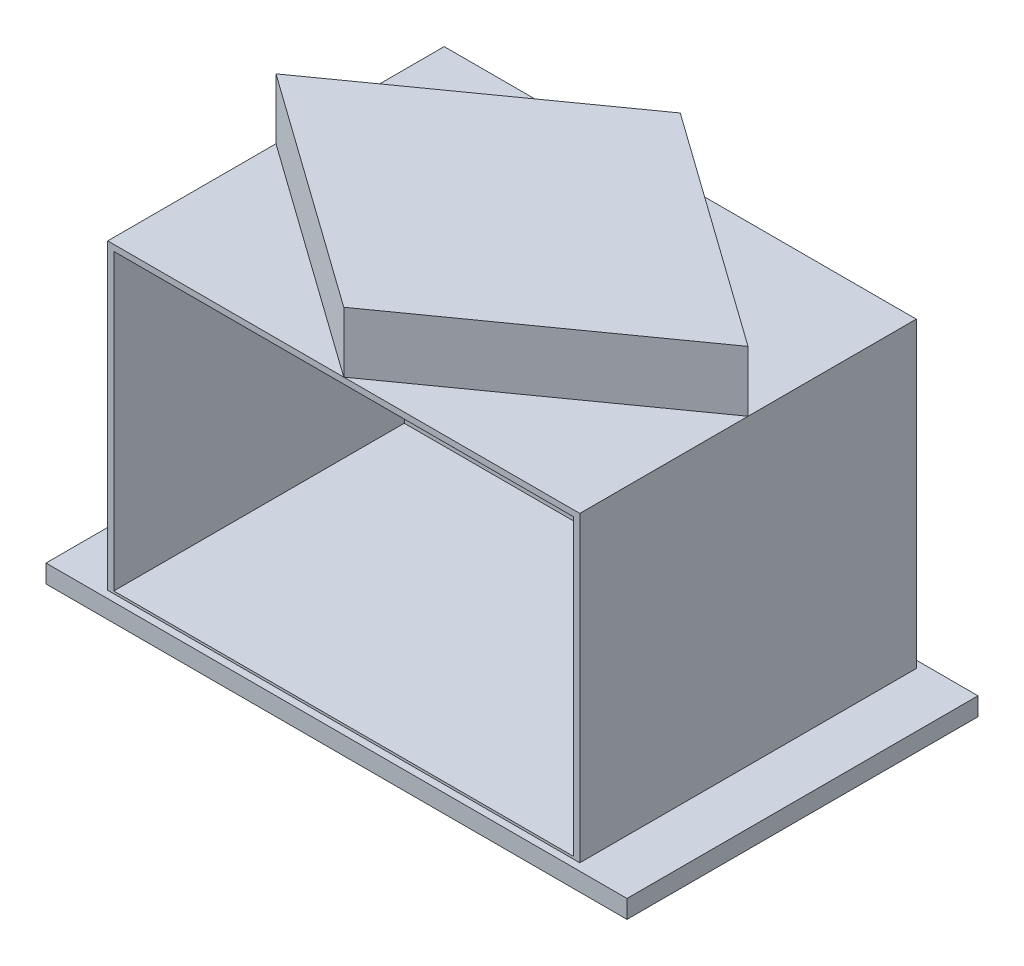
ISO-10303-21;
HEADER;
FILE_DESCRIPTION(('STEP AP214'),'2;1');
FILE_NAME('part.step','',(''),(''),'','','');
FILE_SCHEMA(('AUTOMOTIVE_DESIGN { 1 0 10303 214 1 1 1 1 }'));
ENDSEC;
DATA;
#1=APPLICATION_CONTEXT('core data for automotive mechanical design processes');
#2=APPLICATION_PROTOCOL_DEFINITION('international standard','automotive_design',2000,#1);
#3=PRODUCT_CONTEXT('',#1,'mechanical');
#4=PRODUCT('Part','Part','',(#3));
#5=PRODUCT_RELATED_PRODUCT_CATEGORY('part','',(#4));
#6=PRODUCT_DEFINITION_FORMATION('','',#4);
#7=PRODUCT_DEFINITION_CONTEXT('part definition',#1,'design');
#8=PRODUCT_DEFINITION('design','',#6,#7);
#9=PRODUCT_DEFINITION_SHAPE('','',#8);
#10=(LENGTH_UNIT() NAMED_UNIT(*) SI_UNIT(.MILLI.,.METRE.));
#11=(NAMED_UNIT(*) PLANE_ANGLE_UNIT() SI_UNIT($,.RADIAN.));
#12=(NAMED_UNIT(*) SI_UNIT($,.STERADIAN.) SOLID_ANGLE_UNIT());
#13=UNCERTAINTY_MEASURE_WITH_UNIT(LENGTH_MEASURE(1.E-05),#10,'distance_accuracy_value','');
#14=(GEOMETRIC_REPRESENTATION_CONTEXT(3) GLOBAL_UNCERTAINTY_ASSIGNED_CONTEXT((#13)) GLOBAL_UNIT_ASSIGNED_CONTEXT((#10,
#11,#12)) REPRESENTATION_CONTEXT('',''));
#15=CARTESIAN_POINT('',(0.,0.,0.));
#16=DIRECTION('',(0.,0.,1.));
#17=DIRECTION('',(1.,0.,0.));
#18=AXIS2_PLACEMENT_3D('',#15,#16,#17);
#19=CARTESIAN_POINT('',(0.,250.,0.));
#20=DIRECTION('',(0.,-1.,0.));
#21=DIRECTION('',(0.,0.,-1.));
#22=AXIS2_PLACEMENT_3D('',#19,#20,#21);
#23=PLANE('',#22);
#24=DIRECTION('',(-0.814297396356069,0.,-0.580447887658942));
#25=VECTOR('',#24,1.);
#26=CARTESIAN_POINT('',(195.,250.,0.));
#27=LINE('',#26,#25);
#28=CARTESIAN_POINT('',(195.,250.,0.));
#29=VERTEX_POINT('',#28);
#30=CARTESIAN_POINT('',(0.,250.,-139.));
#31=VERTEX_POINT('',#30);
#32=EDGE_CURVE('E177',#29,#31,#27,.T.);
#33=ORIENTED_EDGE('',*,*,#32,.F.);
#34=DIRECTION('',(0.,0.,-1.));
#35=VECTOR('',#34,1.);
#36=CARTESIAN_POINT('',(195.,250.,39.));
#37=LINE('',#36,#35);
#38=CARTESIAN_POINT('',(195.,250.,-139.));
#39=VERTEX_POINT('',#38);
#40=EDGE_CURVE('E232',#29,#39,#37,.T.);
#41=ORIENTED_EDGE('',*,*,#40,.T.);
#42=DIRECTION('',(-1.,0.,0.));
#43=VECTOR('',#42,1.);
#44=CARTESIAN_POINT('',(-195.,250.,-139.));
#45=LINE('',#44,#43);
#46=EDGE_CURVE('E233',#39,#31,#45,.T.);
#47=ORIENTED_EDGE('',*,*,#46,.T.);
#48=EDGE_LOOP('',(#33,#41,#47));
#49=FACE_BOUND('',#48,.T.);
#50=ADVANCED_FACE('F39',(#49),#23,.F.);
#51=DIRECTION('',(0.814297396356069,0.,-0.580447887658942));
#52=VECTOR('',#51,1.);
#53=CARTESIAN_POINT('',(0.,250.,139.));
#54=LINE('',#53,#52);
#55=CARTESIAN_POINT('',(1.11022302462516E-13,250.,139.));
#56=VERTEX_POINT('',#55);
#57=EDGE_CURVE('E56',#56,#29,#54,.T.);
#58=ORIENTED_EDGE('',*,*,#57,.F.);
#59=DIRECTION('',(-1.,0.,0.));
#60=VECTOR('',#59,1.);
#61=CARTESIAN_POINT('',(195.,250.,139.));
#62=LINE('',#61,#60);
#63=CARTESIAN_POINT('',(195.,250.,139.));
#64=VERTEX_POINT('',#63);
#65=EDGE_CURVE('E216',#64,#56,#62,.T.);
#66=ORIENTED_EDGE('',*,*,#65,.F.);
#67=EDGE_CURVE('E229',#64,#29,#37,.T.);
#68=ORIENTED_EDGE('',*,*,#67,.T.);
#69=EDGE_LOOP('',(#58,#66,#68));
#70=FACE_BOUND('',#69,.T.);
#71=ADVANCED_FACE('F305',(#70),#23,.F.);
#72=DIRECTION('',(0.814297396356069,0.,0.580447887658942));
#73=VECTOR('',#72,1.);
#74=CARTESIAN_POINT('',(-195.,250.,0.));
#75=LINE('',#74,#73);
#76=CARTESIAN_POINT('',(-195.,250.,0.));
#77=VERTEX_POINT('',#76);
#78=EDGE_CURVE('E329',#77,#56,#75,.T.);
#79=ORIENTED_EDGE('',*,*,#78,.F.);
#80=DIRECTION('',(0.,0.,1.));
#81=VECTOR('',#80,1.);
#82=CARTESIAN_POINT('',(-195.,250.,39.));
#83=LINE('',#82,#81);
#84=CARTESIAN_POINT('',(-195.,250.,139.));
#85=VERTEX_POINT('',#84);
#86=EDGE_CURVE('E236',#77,#85,#83,.T.);
#87=ORIENTED_EDGE('',*,*,#86,.T.);
#88=EDGE_CURVE('E209',#56,#85,#62,.T.);
#89=ORIENTED_EDGE('',*,*,#88,.F.);
#90=EDGE_LOOP('',(#79,#87,#89));
#91=FACE_BOUND('',#90,.T.);
#92=ADVANCED_FACE('F313',(#91),#23,.F.);
#93=DIRECTION('',(-0.814297396356069,0.,0.580447887658942));
#94=VECTOR('',#93,1.);
#95=CARTESIAN_POINT('',(0.,250.,-139.));
#96=LINE('',#95,#94);
#97=EDGE_CURVE('E64',#31,#77,#96,.T.);
#98=ORIENTED_EDGE('',*,*,#97,.F.);
#99=CARTESIAN_POINT('',(-195.,250.,-139.));
#100=VERTEX_POINT('',#99);
#101=EDGE_CURVE('E231',#31,#100,#45,.T.);
#102=ORIENTED_EDGE('',*,*,#101,.T.);
#103=EDGE_CURVE('E237',#100,#77,#83,.T.);
#104=ORIENTED_EDGE('',*,*,#103,.T.);
#105=EDGE_LOOP('',(#98,#102,#104));
#106=FACE_BOUND('',#105,.T.);
#107=ADVANCED_FACE('F308',(#106),#23,.F.);
#108=CARTESIAN_POINT('',(0.,0.,0.));
#109=DIRECTION('',(0.,-1.,0.));
#110=DIRECTION('',(0.,0.,-1.));
#111=AXIS2_PLACEMENT_3D('',#108,#109,#110);
#112=PLANE('',#111);
#113=DIRECTION('',(0.,0.,-1.));
#114=VECTOR('',#113,1.);
#115=CARTESIAN_POINT('',(240.,0.,145.));
#116=LINE('',#115,#114);
#117=CARTESIAN_POINT('',(240.,0.,145.));
#118=VERTEX_POINT('',#117);
#119=CARTESIAN_POINT('',(240.,0.,-145.));
#120=VERTEX_POINT('',#119);
#121=EDGE_CURVE('E252',#118,#120,#116,.T.);
#122=ORIENTED_EDGE('',*,*,#121,.T.);
#123=DIRECTION('',(-1.,0.,0.));
#124=VECTOR('',#123,1.);
#125=CARTESIAN_POINT('',(-240.,0.,-145.));
#126=LINE('',#125,#124);
#127=CARTESIAN_POINT('',(-240.,0.,-145.));
#128=VERTEX_POINT('',#127);
#129=EDGE_CURVE('E268',#120,#128,#126,.T.);
#130=ORIENTED_EDGE('',*,*,#129,.T.);
#131=DIRECTION('',(0.,0.,1.));
#132=VECTOR('',#131,1.);
#133=CARTESIAN_POINT('',(-240.,0.,145.));
#134=LINE('',#133,#132);
#135=CARTESIAN_POINT('',(-240.,0.,145.));
#136=VERTEX_POINT('',#135);
#137=EDGE_CURVE('E271',#128,#136,#134,.T.);
#138=ORIENTED_EDGE('',*,*,#137,.T.);
#139=DIRECTION('',(1.,0.,0.));
#140=VECTOR('',#139,1.);
#141=CARTESIAN_POINT('',(-240.,0.,145.));
#142=LINE('',#141,#140);
#143=EDGE_CURVE('E257',#136,#118,#142,.T.);
#144=ORIENTED_EDGE('',*,*,#143,.T.);
#145=EDGE_LOOP('',(#122,#130,#138,#144));
#146=FACE_BOUND('',#145,.T.);
#147=DIRECTION('',(1.,0.,0.));
#148=VECTOR('',#147,1.);
#149=CARTESIAN_POINT('',(-195.,0.,139.));
#150=LINE('',#149,#148);
#151=CARTESIAN_POINT('',(-195.,0.,139.));
#152=VERTEX_POINT('',#151);
#153=CARTESIAN_POINT('',(195.,0.,139.));
#154=VERTEX_POINT('',#153);
#155=EDGE_CURVE('E222',#152,#154,#150,.T.);
#156=ORIENTED_EDGE('',*,*,#155,.F.);
#157=DIRECTION('',(0.,0.,1.));
#158=VECTOR('',#157,1.);
#159=CARTESIAN_POINT('',(-195.,0.,39.));
#160=LINE('',#159,#158);
#161=CARTESIAN_POINT('',(-195.,0.,-139.));
#162=VERTEX_POINT('',#161);
#163=EDGE_CURVE('E245',#162,#152,#160,.T.);
#164=ORIENTED_EDGE('',*,*,#163,.F.);
#165=DIRECTION('',(-1.,0.,0.));
#166=VECTOR('',#165,1.);
#167=CARTESIAN_POINT('',(-195.,0.,-139.));
#168=LINE('',#167,#166);
#169=CARTESIAN_POINT('',(195.,0.,-139.));
#170=VERTEX_POINT('',#169);
#171=EDGE_CURVE('E242',#170,#162,#168,.T.);
#172=ORIENTED_EDGE('',*,*,#171,.F.);
#173=DIRECTION('',(0.,0.,-1.));
#174=VECTOR('',#173,1.);
#175=CARTESIAN_POINT('',(195.,0.,39.));
#176=LINE('',#175,#174);
#177=EDGE_CURVE('E228',#154,#170,#176,.T.);
#178=ORIENTED_EDGE('',*,*,#177,.F.);
#179=EDGE_LOOP('',(#156,#164,#172,#178));
#180=FACE_BOUND('',#179,.T.);
#181=ADVANCED_FACE('F286',(#146,#180),#112,.F.);
#182=CARTESIAN_POINT('',(240.,-15.,145.));
#183=DIRECTION('',(1.,0.,0.));
#184=DIRECTION('',(0.,0.,-1.));
#185=AXIS2_PLACEMENT_3D('',#182,#183,#184);
#186=PLANE('',#185);
#187=ORIENTED_EDGE('',*,*,#121,.F.);
#188=DIRECTION('',(0.,1.,0.));
#189=VECTOR('',#188,1.);
#190=CARTESIAN_POINT('',(240.,-15.,145.));
#191=LINE('',#190,#189);
#192=CARTESIAN_POINT('',(240.,-15.,145.));
#193=VERTEX_POINT('',#192);
#194=EDGE_CURVE('E11',#193,#118,#191,.T.);
#195=ORIENTED_EDGE('',*,*,#194,.F.);
#196=DIRECTION('',(0.,0.,-1.));
#197=VECTOR('',#196,1.);
#198=CARTESIAN_POINT('',(240.,-15.,145.));
#199=LINE('',#198,#197);
#200=CARTESIAN_POINT('',(240.,-15.,-145.));
#201=VERTEX_POINT('',#200);
#202=EDGE_CURVE('E253',#193,#201,#199,.T.);
#203=ORIENTED_EDGE('',*,*,#202,.T.);
#204=DIRECTION('',(0.,1.,0.));
#205=VECTOR('',#204,1.);
#206=CARTESIAN_POINT('',(240.,-15.,-145.));
#207=LINE('',#206,#205);
#208=EDGE_CURVE('E43',#201,#120,#207,.T.);
#209=ORIENTED_EDGE('',*,*,#208,.T.);
#210=EDGE_LOOP('',(#187,#195,#203,#209));
#211=FACE_BOUND('',#210,.T.);
#212=ADVANCED_FACE('F41',(#211),#186,.T.);
#213=CARTESIAN_POINT('',(-240.,-15.,145.));
#214=DIRECTION('',(0.,0.,1.));
#215=DIRECTION('',(1.,0.,0.));
#216=AXIS2_PLACEMENT_3D('',#213,#214,#215);
#217=PLANE('',#216);
#218=ORIENTED_EDGE('',*,*,#143,.F.);
#219=DIRECTION('',(0.,1.,0.));
#220=VECTOR('',#219,1.);
#221=CARTESIAN_POINT('',(-240.,-15.,145.));
#222=LINE('',#221,#220);
#223=CARTESIAN_POINT('',(-240.,-15.,145.));
#224=VERTEX_POINT('',#223);
#225=EDGE_CURVE('E48',#224,#136,#222,.T.);
#226=ORIENTED_EDGE('',*,*,#225,.F.);
#227=DIRECTION('',(1.,0.,0.));
#228=VECTOR('',#227,1.);
#229=CARTESIAN_POINT('',(-240.,-15.,145.));
#230=LINE('',#229,#228);
#231=EDGE_CURVE('E263',#224,#193,#230,.T.);
#232=ORIENTED_EDGE('',*,*,#231,.T.);
#233=ORIENTED_EDGE('',*,*,#194,.T.);
#234=EDGE_LOOP('',(#218,#226,#232,#233));
#235=FACE_BOUND('',#234,.T.);
#236=ADVANCED_FACE('F290',(#235),#217,.T.);
#237=CARTESIAN_POINT('',(-240.,-15.,145.));
#238=DIRECTION('',(-1.,0.,0.));
#239=DIRECTION('',(0.,0.,1.));
#240=AXIS2_PLACEMENT_3D('',#237,#238,#239);
#241=PLANE('',#240);
#242=ORIENTED_EDGE('',*,*,#137,.F.);
#243=DIRECTION('',(0.,1.,0.));
#244=VECTOR('',#243,1.);
#245=CARTESIAN_POINT('',(-240.,-15.,-145.));
#246=LINE('',#245,#244);
#247=CARTESIAN_POINT('',(-240.,-15.,-145.));
#248=VERTEX_POINT('',#247);
#249=EDGE_CURVE('E276',#248,#128,#246,.T.);
#250=ORIENTED_EDGE('',*,*,#249,.F.);
#251=DIRECTION('',(0.,0.,1.));
#252=VECTOR('',#251,1.);
#253=CARTESIAN_POINT('',(-240.,-15.,145.));
#254=LINE('',#253,#252);
#255=EDGE_CURVE('E260',#248,#224,#254,.T.);
#256=ORIENTED_EDGE('',*,*,#255,.T.);
#257=ORIENTED_EDGE('',*,*,#225,.T.);
#258=EDGE_LOOP('',(#242,#250,#256,#257));
#259=FACE_BOUND('',#258,.T.);
#260=ADVANCED_FACE('F296',(#259),#241,.T.);
#261=CARTESIAN_POINT('',(-240.,-15.,-145.));
#262=DIRECTION('',(0.,0.,-1.));
#263=DIRECTION('',(-1.,0.,0.));
#264=AXIS2_PLACEMENT_3D('',#261,#262,#263);
#265=PLANE('',#264);
#266=ORIENTED_EDGE('',*,*,#129,.F.);
#267=ORIENTED_EDGE('',*,*,#208,.F.);
#268=DIRECTION('',(-1.,0.,0.));
#269=VECTOR('',#268,1.);
#270=CARTESIAN_POINT('',(-240.,-15.,-145.));
#271=LINE('',#270,#269);
#272=EDGE_CURVE('E256',#201,#248,#271,.T.);
#273=ORIENTED_EDGE('',*,*,#272,.T.);
#274=ORIENTED_EDGE('',*,*,#249,.T.);
#275=EDGE_LOOP('',(#266,#267,#273,#274));
#276=FACE_BOUND('',#275,.T.);
#277=ADVANCED_FACE('F284',(#276),#265,.T.);
#278=CARTESIAN_POINT('',(0.,-15.,0.));
#279=DIRECTION('',(0.,-1.,0.));
#280=DIRECTION('',(0.,0.,-1.));
#281=AXIS2_PLACEMENT_3D('',#278,#279,#280);
#282=PLANE('',#281);
#283=ORIENTED_EDGE('',*,*,#202,.F.);
#284=ORIENTED_EDGE('',*,*,#231,.F.);
#285=ORIENTED_EDGE('',*,*,#255,.F.);
#286=ORIENTED_EDGE('',*,*,#272,.F.);
#287=EDGE_LOOP('',(#283,#284,#285,#286));
#288=FACE_BOUND('',#287,.T.);
#289=ADVANCED_FACE('F293',(#288),#282,.T.);
#290=CARTESIAN_POINT('',(195.,250.,39.));
#291=DIRECTION('',(-1.,0.,0.));
#292=DIRECTION('',(0.,0.,1.));
#293=AXIS2_PLACEMENT_3D('',#290,#291,#292);
#294=PLANE('',#293);
#295=ORIENTED_EDGE('',*,*,#177,.T.);
#296=DIRECTION('',(0.,-1.,0.));
#297=VECTOR('',#296,1.);
#298=CARTESIAN_POINT('',(195.,250.,-139.));
#299=LINE('',#298,#297);
#300=EDGE_CURVE('E249',#39,#170,#299,.T.);
#301=ORIENTED_EDGE('',*,*,#300,.F.);
#302=ORIENTED_EDGE('',*,*,#40,.F.);
#303=ORIENTED_EDGE('',*,*,#67,.F.);
#304=DIRECTION('',(0.,1.,0.));
#305=VECTOR('',#304,1.);
#306=CARTESIAN_POINT('',(195.,0.,139.));
#307=LINE('',#306,#305);
#308=EDGE_CURVE('E225',#154,#64,#307,.T.);
#309=ORIENTED_EDGE('',*,*,#308,.F.);
#310=EDGE_LOOP('',(#295,#301,#302,#303,#309));
#311=FACE_BOUND('',#310,.T.);
#312=ADVANCED_FACE('F393',(#311),#294,.F.);
#313=CARTESIAN_POINT('',(-195.,250.,-139.));
#314=DIRECTION('',(0.,0.,1.));
#315=DIRECTION('',(1.,0.,0.));
#316=AXIS2_PLACEMENT_3D('',#313,#314,#315);
#317=PLANE('',#316);
#318=ORIENTED_EDGE('',*,*,#171,.T.);
#319=DIRECTION('',(0.,-1.,0.));
#320=VECTOR('',#319,1.);
#321=CARTESIAN_POINT('',(-195.,250.,-139.));
#322=LINE('',#321,#320);
#323=EDGE_CURVE('E239',#100,#162,#322,.T.);
#324=ORIENTED_EDGE('',*,*,#323,.F.);
#325=ORIENTED_EDGE('',*,*,#101,.F.);
#326=ORIENTED_EDGE('',*,*,#46,.F.);
#327=ORIENTED_EDGE('',*,*,#300,.T.);
#328=EDGE_LOOP('',(#318,#324,#325,#326,#327));
#329=FACE_BOUND('',#328,.T.);
#330=ADVANCED_FACE('F384',(#329),#317,.F.);
#331=CARTESIAN_POINT('',(-195.,250.,39.));
#332=DIRECTION('',(1.,0.,0.));
#333=DIRECTION('',(0.,0.,-1.));
#334=AXIS2_PLACEMENT_3D('',#331,#332,#333);
#335=PLANE('',#334);
#336=ORIENTED_EDGE('',*,*,#163,.T.);
#337=DIRECTION('',(0.,-1.,0.));
#338=VECTOR('',#337,1.);
#339=CARTESIAN_POINT('',(-195.,250.,139.));
#340=LINE('',#339,#338);
#341=EDGE_CURVE('E219',#85,#152,#340,.T.);
#342=ORIENTED_EDGE('',*,*,#341,.F.);
#343=ORIENTED_EDGE('',*,*,#86,.F.);
#344=ORIENTED_EDGE('',*,*,#103,.F.);
#345=ORIENTED_EDGE('',*,*,#323,.T.);
#346=EDGE_LOOP('',(#336,#342,#343,#344,#345));
#347=FACE_BOUND('',#346,.T.);
#348=ADVANCED_FACE('F379',(#347),#335,.F.);
#349=CARTESIAN_POINT('',(0.,0.,139.));
#350=DIRECTION('',(0.,0.,1.));
#351=DIRECTION('',(1.,0.,0.));
#352=AXIS2_PLACEMENT_3D('',#349,#350,#351);
#353=PLANE('',#352);
#354=DIRECTION('',(0.,-1.,0.));
#355=VECTOR('',#354,1.);
#356=CARTESIAN_POINT('',(-190.,1.99999999999995,139.));
#357=LINE('',#356,#355);
#358=CARTESIAN_POINT('',(-190.,245.,139.));
#359=VERTEX_POINT('',#358);
#360=CARTESIAN_POINT('',(-190.,1.99999999999995,139.));
#361=VERTEX_POINT('',#360);
#362=EDGE_CURVE('E178',#359,#361,#357,.T.);
#363=ORIENTED_EDGE('',*,*,#362,.F.);
#364=DIRECTION('',(-1.,0.,0.));
#365=VECTOR('',#364,1.);
#366=CARTESIAN_POINT('',(-190.,245.,139.));
#367=LINE('',#366,#365);
#368=CARTESIAN_POINT('',(190.,245.,139.));
#369=VERTEX_POINT('',#368);
#370=EDGE_CURVE('E190',#369,#359,#367,.T.);
#371=ORIENTED_EDGE('',*,*,#370,.F.);
#372=DIRECTION('',(0.,1.,0.));
#373=VECTOR('',#372,1.);
#374=CARTESIAN_POINT('',(190.,245.,139.));
#375=LINE('',#374,#373);
#376=CARTESIAN_POINT('',(190.,2.,139.));
#377=VERTEX_POINT('',#376);
#378=EDGE_CURVE('E202',#377,#369,#375,.T.);
#379=ORIENTED_EDGE('',*,*,#378,.F.);
#380=DIRECTION('',(1.,0.,0.));
#381=VECTOR('',#380,1.);
#382=CARTESIAN_POINT('',(190.,2.,139.));
#383=LINE('',#382,#381);
#384=EDGE_CURVE('E180',#361,#377,#383,.T.);
#385=ORIENTED_EDGE('',*,*,#384,.F.);
#386=EDGE_LOOP('',(#363,#371,#379,#385));
#387=FACE_BOUND('',#386,.T.);
#388=ORIENTED_EDGE('',*,*,#65,.T.);
#389=ORIENTED_EDGE('',*,*,#88,.T.);
#390=ORIENTED_EDGE('',*,*,#341,.T.);
#391=ORIENTED_EDGE('',*,*,#155,.T.);
#392=ORIENTED_EDGE('',*,*,#308,.T.);
#393=EDGE_LOOP('',(#388,#389,#390,#391,#392));
#394=FACE_BOUND('',#393,.T.);
#395=ADVANCED_FACE('F376',(#387,#394),#353,.T.);
#396=CARTESIAN_POINT('',(-190.,1.99999999999995,-101.));
#397=DIRECTION('',(-1.,0.,0.));
#398=DIRECTION('',(0.,0.,1.));
#399=AXIS2_PLACEMENT_3D('',#396,#397,#398);
#400=PLANE('',#399);
#401=ORIENTED_EDGE('',*,*,#362,.T.);
#402=DIRECTION('',(0.,0.,1.));
#403=VECTOR('',#402,1.);
#404=CARTESIAN_POINT('',(-190.,1.99999999999995,-101.));
#405=LINE('',#404,#403);
#406=CARTESIAN_POINT('',(-190.,1.99999999999995,-101.));
#407=VERTEX_POINT('',#406);
#408=EDGE_CURVE('E198',#407,#361,#405,.T.);
#409=ORIENTED_EDGE('',*,*,#408,.F.);
#410=DIRECTION('',(0.,-1.,0.));
#411=VECTOR('',#410,1.);
#412=CARTESIAN_POINT('',(-190.,1.99999999999995,-101.));
#413=LINE('',#412,#411);
#414=CARTESIAN_POINT('',(-190.,245.,-101.));
#415=VERTEX_POINT('',#414);
#416=EDGE_CURVE('E186',#415,#407,#413,.T.);
#417=ORIENTED_EDGE('',*,*,#416,.F.);
#418=DIRECTION('',(0.,0.,1.));
#419=VECTOR('',#418,1.);
#420=CARTESIAN_POINT('',(-190.,245.,-101.));
#421=LINE('',#420,#419);
#422=EDGE_CURVE('E207',#415,#359,#421,.T.);
#423=ORIENTED_EDGE('',*,*,#422,.T.);
#424=EDGE_LOOP('',(#401,#409,#417,#423));
#425=FACE_BOUND('',#424,.T.);
#426=ADVANCED_FACE('F367',(#425),#400,.F.);
#427=CARTESIAN_POINT('',(-190.,245.,-101.));
#428=DIRECTION('',(0.,1.,0.));
#429=DIRECTION('',(0.,0.,1.));
#430=AXIS2_PLACEMENT_3D('',#427,#428,#429);
#431=PLANE('',#430);
#432=ORIENTED_EDGE('',*,*,#370,.T.);
#433=ORIENTED_EDGE('',*,*,#422,.F.);
#434=DIRECTION('',(-1.,0.,0.));
#435=VECTOR('',#434,1.);
#436=CARTESIAN_POINT('',(-190.,245.,-101.));
#437=LINE('',#436,#435);
#438=CARTESIAN_POINT('',(190.,245.,-101.));
#439=VERTEX_POINT('',#438);
#440=EDGE_CURVE('E196',#439,#415,#437,.T.);
#441=ORIENTED_EDGE('',*,*,#440,.F.);
#442=DIRECTION('',(0.,0.,1.));
#443=VECTOR('',#442,1.);
#444=CARTESIAN_POINT('',(190.,245.,-101.));
#445=LINE('',#444,#443);
#446=EDGE_CURVE('E210',#439,#369,#445,.T.);
#447=ORIENTED_EDGE('',*,*,#446,.T.);
#448=EDGE_LOOP('',(#432,#433,#441,#447));
#449=FACE_BOUND('',#448,.T.);
#450=ADVANCED_FACE('F363',(#449),#431,.F.);
#451=CARTESIAN_POINT('',(190.,245.,-101.));
#452=DIRECTION('',(1.,0.,0.));
#453=DIRECTION('',(0.,0.,-1.));
#454=AXIS2_PLACEMENT_3D('',#451,#452,#453);
#455=PLANE('',#454);
#456=ORIENTED_EDGE('',*,*,#378,.T.);
#457=ORIENTED_EDGE('',*,*,#446,.F.);
#458=DIRECTION('',(0.,1.,0.));
#459=VECTOR('',#458,1.);
#460=CARTESIAN_POINT('',(190.,245.,-101.));
#461=LINE('',#460,#459);
#462=CARTESIAN_POINT('',(190.,2.,-101.));
#463=VERTEX_POINT('',#462);
#464=EDGE_CURVE('E193',#463,#439,#461,.T.);
#465=ORIENTED_EDGE('',*,*,#464,.F.);
#466=DIRECTION('',(0.,0.,1.));
#467=VECTOR('',#466,1.);
#468=CARTESIAN_POINT('',(190.,2.,-101.));
#469=LINE('',#468,#467);
#470=EDGE_CURVE('E212',#463,#377,#469,.T.);
#471=ORIENTED_EDGE('',*,*,#470,.T.);
#472=EDGE_LOOP('',(#456,#457,#465,#471));
#473=FACE_BOUND('',#472,.T.);
#474=ADVANCED_FACE('F366',(#473),#455,.F.);
#475=CARTESIAN_POINT('',(190.,2.,-101.));
#476=DIRECTION('',(0.,-1.,0.));
#477=DIRECTION('',(1.,0.,0.));
#478=AXIS2_PLACEMENT_3D('',#475,#476,#477);
#479=PLANE('',#478);
#480=ORIENTED_EDGE('',*,*,#384,.T.);
#481=ORIENTED_EDGE('',*,*,#470,.F.);
#482=DIRECTION('',(1.,0.,0.));
#483=VECTOR('',#482,1.);
#484=CARTESIAN_POINT('',(190.,2.,-101.));
#485=LINE('',#484,#483);
#486=EDGE_CURVE('E189',#407,#463,#485,.T.);
#487=ORIENTED_EDGE('',*,*,#486,.F.);
#488=ORIENTED_EDGE('',*,*,#408,.T.);
#489=EDGE_LOOP('',(#480,#481,#487,#488));
#490=FACE_BOUND('',#489,.T.);
#491=ADVANCED_FACE('F361',(#490),#479,.F.);
#492=CARTESIAN_POINT('',(0.,0.,-101.));
#493=DIRECTION('',(0.,0.,-1.));
#494=DIRECTION('',(-1.,0.,0.));
#495=AXIS2_PLACEMENT_3D('',#492,#493,#494);
#496=PLANE('',#495);
#497=ORIENTED_EDGE('',*,*,#416,.T.);
#498=ORIENTED_EDGE('',*,*,#486,.T.);
#499=ORIENTED_EDGE('',*,*,#464,.T.);
#500=ORIENTED_EDGE('',*,*,#440,.T.);
#501=EDGE_LOOP('',(#497,#498,#499,#500));
#502=FACE_BOUND('',#501,.T.);
#503=ADVANCED_FACE('F359',(#502),#496,.F.);
#504=CARTESIAN_POINT('',(195.,300.,0.));
#505=DIRECTION('',(-0.580447887658942,0.,0.814297396356069));
#506=DIRECTION('',(0.814297396356069,0.,0.580447887658942));
#507=AXIS2_PLACEMENT_3D('',#504,#505,#506);
#508=PLANE('',#507);
#509=ORIENTED_EDGE('',*,*,#32,.T.);
#510=DIRECTION('',(0.,-1.,0.));
#511=VECTOR('',#510,1.);
#512=CARTESIAN_POINT('',(0.,300.,-139.));
#513=LINE('',#512,#511);
#514=CARTESIAN_POINT('',(0.,300.,-139.));
#515=VERTEX_POINT('',#514);
#516=EDGE_CURVE('E159',#515,#31,#513,.T.);
#517=ORIENTED_EDGE('',*,*,#516,.F.);
#518=DIRECTION('',(-0.814297396356069,0.,-0.580447887658942));
#519=VECTOR('',#518,1.);
#520=CARTESIAN_POINT('',(195.,300.,0.));
#521=LINE('',#520,#519);
#522=CARTESIAN_POINT('',(195.,300.,0.));
#523=VERTEX_POINT('',#522);
#524=EDGE_CURVE('E166',#523,#515,#521,.T.);
#525=ORIENTED_EDGE('',*,*,#524,.F.);
#526=DIRECTION('',(0.,-1.,0.));
#527=VECTOR('',#526,1.);
#528=CARTESIAN_POINT('',(195.,300.,0.));
#529=LINE('',#528,#527);
#530=EDGE_CURVE('E339',#523,#29,#529,.T.);
#531=ORIENTED_EDGE('',*,*,#530,.T.);
#532=EDGE_LOOP('',(#509,#517,#525,#531));
#533=FACE_BOUND('',#532,.T.);
#534=ADVANCED_FACE('F176',(#533),#508,.F.);
#535=CARTESIAN_POINT('',(0.,300.,-139.));
#536=DIRECTION('',(0.580447887658942,0.,0.814297396356069));
#537=DIRECTION('',(0.814297396356069,0.,-0.580447887658942));
#538=AXIS2_PLACEMENT_3D('',#535,#536,#537);
#539=PLANE('',#538);
#540=ORIENTED_EDGE('',*,*,#97,.T.);
#541=DIRECTION('',(0.,-1.,0.));
#542=VECTOR('',#541,1.);
#543=CARTESIAN_POINT('',(-195.,300.,0.));
#544=LINE('',#543,#542);
#545=CARTESIAN_POINT('',(-195.,300.,0.));
#546=VERTEX_POINT('',#545);
#547=EDGE_CURVE('E162',#546,#77,#544,.T.);
#548=ORIENTED_EDGE('',*,*,#547,.F.);
#549=DIRECTION('',(-0.814297396356069,0.,0.580447887658942));
#550=VECTOR('',#549,1.);
#551=CARTESIAN_POINT('',(0.,300.,-139.));
#552=LINE('',#551,#550);
#553=EDGE_CURVE('E155',#515,#546,#552,.T.);
#554=ORIENTED_EDGE('',*,*,#553,.F.);
#555=ORIENTED_EDGE('',*,*,#516,.T.);
#556=EDGE_LOOP('',(#540,#548,#554,#555));
#557=FACE_BOUND('',#556,.T.);
#558=ADVANCED_FACE('F157',(#557),#539,.F.);
#559=CARTESIAN_POINT('',(-195.,300.,0.));
#560=DIRECTION('',(0.580447887658942,0.,-0.814297396356069));
#561=DIRECTION('',(-0.814297396356069,0.,-0.580447887658942));
#562=AXIS2_PLACEMENT_3D('',#559,#560,#561);
#563=PLANE('',#562);
#564=ORIENTED_EDGE('',*,*,#78,.T.);
#565=DIRECTION('',(0.,-1.,0.));
#566=VECTOR('',#565,1.);
#567=CARTESIAN_POINT('',(0.,300.,139.));
#568=LINE('',#567,#566);
#569=CARTESIAN_POINT('',(0.,300.,139.));
#570=VERTEX_POINT('',#569);
#571=EDGE_CURVE('E182',#570,#56,#568,.T.);
#572=ORIENTED_EDGE('',*,*,#571,.F.);
#573=DIRECTION('',(0.814297396356069,0.,0.580447887658942));
#574=VECTOR('',#573,1.);
#575=CARTESIAN_POINT('',(-195.,300.,0.));
#576=LINE('',#575,#574);
#577=EDGE_CURVE('E165',#546,#570,#576,.T.);
#578=ORIENTED_EDGE('',*,*,#577,.F.);
#579=ORIENTED_EDGE('',*,*,#547,.T.);
#580=EDGE_LOOP('',(#564,#572,#578,#579));
#581=FACE_BOUND('',#580,.T.);
#582=ADVANCED_FACE('F337',(#581),#563,.F.);
#583=CARTESIAN_POINT('',(0.,300.,139.));
#584=DIRECTION('',(-0.580447887658942,0.,-0.814297396356069));
#585=DIRECTION('',(-0.814297396356069,0.,0.580447887658942));
#586=AXIS2_PLACEMENT_3D('',#583,#584,#585);
#587=PLANE('',#586);
#588=ORIENTED_EDGE('',*,*,#57,.T.);
#589=ORIENTED_EDGE('',*,*,#530,.F.);
#590=DIRECTION('',(0.814297396356069,0.,-0.580447887658942));
#591=VECTOR('',#590,1.);
#592=CARTESIAN_POINT('',(0.,300.,139.));
#593=LINE('',#592,#591);
#594=EDGE_CURVE('E171',#570,#523,#593,.T.);
#595=ORIENTED_EDGE('',*,*,#594,.F.);
#596=ORIENTED_EDGE('',*,*,#571,.T.);
#597=EDGE_LOOP('',(#588,#589,#595,#596));
#598=FACE_BOUND('',#597,.T.);
#599=ADVANCED_FACE('F345',(#598),#587,.F.);
#600=CARTESIAN_POINT('',(0.,300.,0.));
#601=DIRECTION('',(0.,1.,0.));
#602=DIRECTION('',(0.,0.,1.));
#603=AXIS2_PLACEMENT_3D('',#600,#601,#602);
#604=PLANE('',#603);
#605=ORIENTED_EDGE('',*,*,#524,.T.);
#606=ORIENTED_EDGE('',*,*,#553,.T.);
#607=ORIENTED_EDGE('',*,*,#577,.T.);
#608=ORIENTED_EDGE('',*,*,#594,.T.);
#609=EDGE_LOOP('',(#605,#606,#607,#608));
#610=FACE_BOUND('',#609,.T.);
#611=ADVANCED_FACE('F169',(#610),#604,.T.);
#612=CLOSED_SHELL('',(#50,#71,#92,#107,#181,#212,#236,#260,#277,#289,#312,#330,#348,#395,#426,
#450,#474,#491,#503,#534,#558,#582,#599,#611));
#613=MANIFOLD_SOLID_BREP('B2',#612);
#614=ADVANCED_BREP_SHAPE_REPRESENTATION('',(#18,#613),#14);
#615=SHAPE_DEFINITION_REPRESENTATION(#9,#614);
ENDSEC;
END-ISO-10303-21;
